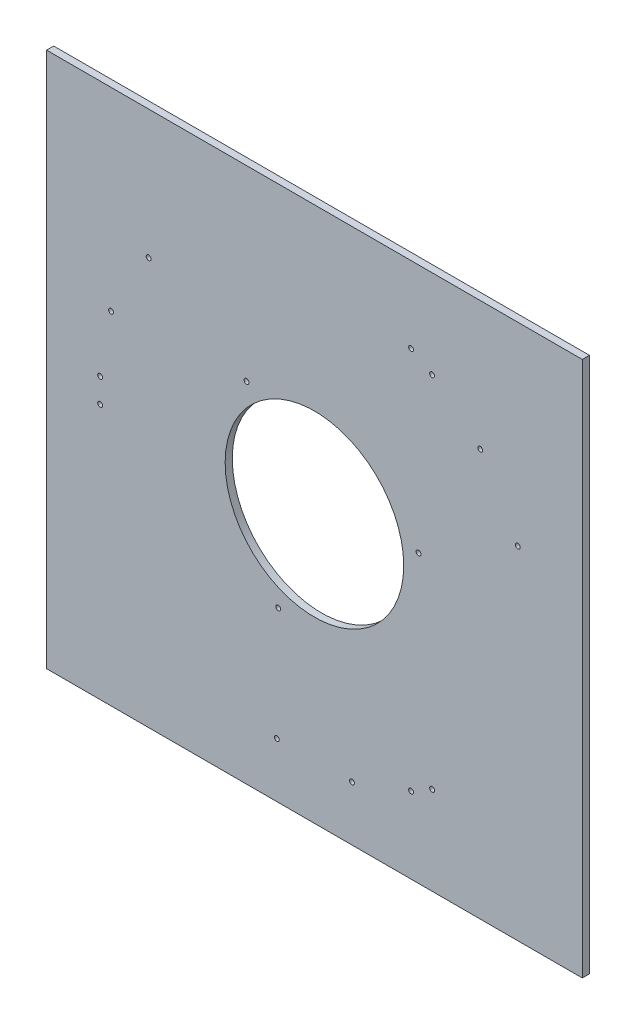
ISO-10303-21;
HEADER;
FILE_DESCRIPTION(('STEP AP214'),'2;1');
FILE_NAME('part.step','',(''),(''),'','','');
FILE_SCHEMA(('AUTOMOTIVE_DESIGN { 1 0 10303 214 1 1 1 1 }'));
ENDSEC;
DATA;
#1=APPLICATION_CONTEXT('core data for automotive mechanical design processes');
#2=APPLICATION_PROTOCOL_DEFINITION('international standard','automotive_design',2000,#1);
#3=PRODUCT_CONTEXT('',#1,'mechanical');
#4=PRODUCT('Part','Part','',(#3));
#5=PRODUCT_RELATED_PRODUCT_CATEGORY('part','',(#4));
#6=PRODUCT_DEFINITION_FORMATION('','',#4);
#7=PRODUCT_DEFINITION_CONTEXT('part definition',#1,'design');
#8=PRODUCT_DEFINITION('design','',#6,#7);
#9=PRODUCT_DEFINITION_SHAPE('','',#8);
#10=(LENGTH_UNIT() NAMED_UNIT(*) SI_UNIT(.MILLI.,.METRE.));
#11=(NAMED_UNIT(*) PLANE_ANGLE_UNIT() SI_UNIT($,.RADIAN.));
#12=(NAMED_UNIT(*) SI_UNIT($,.STERADIAN.) SOLID_ANGLE_UNIT());
#13=UNCERTAINTY_MEASURE_WITH_UNIT(LENGTH_MEASURE(1.E-05),#10,'distance_accuracy_value','');
#14=(GEOMETRIC_REPRESENTATION_CONTEXT(3) GLOBAL_UNCERTAINTY_ASSIGNED_CONTEXT((#13)) GLOBAL_UNIT_ASSIGNED_CONTEXT((#10,
#11,#12)) REPRESENTATION_CONTEXT('',''));
#15=CARTESIAN_POINT('',(0.,0.,0.));
#16=DIRECTION('',(0.,0.,1.));
#17=DIRECTION('',(1.,0.,0.));
#18=AXIS2_PLACEMENT_3D('',#15,#16,#17);
#19=CARTESIAN_POINT('',(0.,0.,5.));
#20=DIRECTION('',(0.,0.,-1.));
#21=DIRECTION('',(-1.,0.,0.));
#22=AXIS2_PLACEMENT_3D('',#19,#20,#21);
#23=PLANE('',#22);
#24=CARTESIAN_POINT('',(82.3612159321663,-125.653810567667,5.));
#25=DIRECTION('',(0.,0.,1.));
#26=DIRECTION('',(1.,0.,0.));
#27=AXIS2_PLACEMENT_3D('',#24,#25,#26);
#28=CIRCLE('',#27,1.69999999999999);
#29=CARTESIAN_POINT('',(84.0612159321663,-125.653810567667,5.));
#30=VERTEX_POINT('',#29);
#31=EDGE_CURVE('E207',#30,#30,#28,.T.);
#32=ORIENTED_EDGE('',*,*,#31,.F.);
#33=EDGE_LOOP('',(#32));
#34=FACE_BOUND('',#33,.T.);
#35=CARTESIAN_POINT('',(67.6387840678362,-134.153810567664,5.));
#36=DIRECTION('',(0.,0.,1.));
#37=DIRECTION('',(1.,0.,0.));
#38=AXIS2_PLACEMENT_3D('',#35,#36,#37);
#39=CIRCLE('',#38,1.69999999999999);
#40=CARTESIAN_POINT('',(69.3387840678362,-134.153810567664,5.));
#41=VERTEX_POINT('',#40);
#42=EDGE_CURVE('E201',#41,#41,#39,.T.);
#43=ORIENTED_EDGE('',*,*,#42,.F.);
#44=EDGE_LOOP('',(#43));
#45=FACE_BOUND('',#44,.T.);
#46=CARTESIAN_POINT('',(-150.,8.49999999999623,5.));
#47=DIRECTION('',(0.,0.,1.));
#48=DIRECTION('',(1.,0.,0.));
#49=AXIS2_PLACEMENT_3D('',#46,#47,#48);
#50=CIRCLE('',#49,1.69999999999998);
#51=CARTESIAN_POINT('',(-148.3,8.49999999999623,5.));
#52=VERTEX_POINT('',#51);
#53=EDGE_CURVE('E189',#52,#52,#50,.T.);
#54=ORIENTED_EDGE('',*,*,#53,.F.);
#55=EDGE_LOOP('',(#54));
#56=FACE_BOUND('',#55,.T.);
#57=CARTESIAN_POINT('',(67.638784067835,134.153810567664,5.));
#58=DIRECTION('',(0.,0.,1.));
#59=DIRECTION('',(1.,0.,0.));
#60=AXIS2_PLACEMENT_3D('',#57,#58,#59);
#61=CIRCLE('',#60,1.69999999999999);
#62=CARTESIAN_POINT('',(69.338784067835,134.153810567664,5.));
#63=VERTEX_POINT('',#62);
#64=EDGE_CURVE('E183',#63,#63,#61,.T.);
#65=ORIENTED_EDGE('',*,*,#64,.F.);
#66=EDGE_LOOP('',(#65));
#67=FACE_BOUND('',#66,.T.);
#68=CARTESIAN_POINT('',(82.3612159321651,125.653810567667,5.));
#69=DIRECTION('',(0.,0.,1.));
#70=DIRECTION('',(1.,0.,0.));
#71=AXIS2_PLACEMENT_3D('',#68,#69,#70);
#72=CIRCLE('',#71,1.69999999999999);
#73=CARTESIAN_POINT('',(84.0612159321651,125.653810567667,5.));
#74=VERTEX_POINT('',#73);
#75=EDGE_CURVE('E177',#74,#74,#72,.T.);
#76=ORIENTED_EDGE('',*,*,#75,.F.);
#77=EDGE_LOOP('',(#76));
#78=FACE_BOUND('',#77,.T.);
#79=CARTESIAN_POINT('',(72.8757737229035,12.8499651473521,5.));
#80=DIRECTION('',(0.,0.,1.));
#81=DIRECTION('',(1.,0.,0.));
#82=AXIS2_PLACEMENT_3D('',#79,#80,#81);
#83=CIRCLE('',#82,1.69999999999999);
#84=CARTESIAN_POINT('',(74.5757737229035,12.8499651473521,5.));
#85=VERTEX_POINT('',#84);
#86=EDGE_CURVE('E171',#85,#85,#83,.T.);
#87=ORIENTED_EDGE('',*,*,#86,.F.);
#88=EDGE_LOOP('',(#87));
#89=FACE_BOUND('',#88,.T.);
#90=CARTESIAN_POINT('',(-47.5662831168036,56.6872887908046,5.));
#91=DIRECTION('',(0.,0.,1.));
#92=DIRECTION('',(1.,0.,0.));
#93=AXIS2_PLACEMENT_3D('',#90,#91,#92);
#94=CIRCLE('',#93,1.69999999999999);
#95=CARTESIAN_POINT('',(-45.8662831168036,56.6872887908046,5.));
#96=VERTEX_POINT('',#95);
#97=EDGE_CURVE('E165',#96,#96,#94,.T.);
#98=ORIENTED_EDGE('',*,*,#97,.F.);
#99=EDGE_LOOP('',(#98));
#100=FACE_BOUND('',#99,.T.);
#101=CARTESIAN_POINT('',(-116.055733132526,97.3823228675097,5.));
#102=DIRECTION('',(0.,0.,1.));
#103=DIRECTION('',(1.,0.,0.));
#104=AXIS2_PLACEMENT_3D('',#101,#102,#103);
#105=CIRCLE('',#104,1.69999999999999);
#106=CARTESIAN_POINT('',(-114.355733132526,97.3823228675097,5.));
#107=VERTEX_POINT('',#106);
#108=EDGE_CURVE('E153',#107,#107,#105,.T.);
#109=ORIENTED_EDGE('',*,*,#108,.F.);
#110=EDGE_LOOP('',(#109));
#111=FACE_BOUND('',#110,.T.);
#112=CARTESIAN_POINT('',(116.055733132525,97.3823228675114,5.));
#113=DIRECTION('',(0.,0.,1.));
#114=DIRECTION('',(1.,0.,0.));
#115=AXIS2_PLACEMENT_3D('',#112,#113,#114);
#116=CIRCLE('',#115,1.69999999999999);
#117=CARTESIAN_POINT('',(117.755733132525,97.3823228675114,5.));
#118=VERTEX_POINT('',#117);
#119=EDGE_CURVE('E135',#118,#118,#116,.T.);
#120=ORIENTED_EDGE('',*,*,#119,.F.);
#121=EDGE_LOOP('',(#120));
#122=FACE_BOUND('',#121,.T.);
#123=CARTESIAN_POINT('',(26.3076989165401,-149.198374581349,5.));
#124=DIRECTION('',(0.,0.,1.));
#125=DIRECTION('',(1.,0.,0.));
#126=AXIS2_PLACEMENT_3D('',#123,#124,#125);
#127=CIRCLE('',#126,1.7);
#128=CARTESIAN_POINT('',(28.0076989165401,-149.198374581349,5.));
#129=VERTEX_POINT('',#128);
#130=EDGE_CURVE('E123',#129,#129,#127,.T.);
#131=ORIENTED_EDGE('',*,*,#130,.F.);
#132=EDGE_LOOP('',(#131));
#133=FACE_BOUND('',#132,.T.);
#134=CARTESIAN_POINT('',(0.,0.,5.));
#135=DIRECTION('',(0.,0.,1.));
#136=DIRECTION('',(1.,0.,0.));
#137=AXIS2_PLACEMENT_3D('',#134,#135,#136);
#138=CIRCLE('',#137,62.5);
#139=CARTESIAN_POINT('',(62.5,0.,5.));
#140=VERTEX_POINT('',#139);
#141=EDGE_CURVE('E104',#140,#140,#138,.T.);
#142=ORIENTED_EDGE('',*,*,#141,.F.);
#143=EDGE_LOOP('',(#142));
#144=FACE_BOUND('',#143,.T.);
#145=DIRECTION('',(0.,-1.,0.));
#146=VECTOR('',#145,1.);
#147=CARTESIAN_POINT('',(-187.5,187.5,5.));
#148=LINE('',#147,#146);
#149=CARTESIAN_POINT('',(-187.5,187.5,5.));
#150=VERTEX_POINT('',#149);
#151=CARTESIAN_POINT('',(-187.5,-187.5,5.));
#152=VERTEX_POINT('',#151);
#153=EDGE_CURVE('E89',#150,#152,#148,.T.);
#154=ORIENTED_EDGE('',*,*,#153,.T.);
#155=DIRECTION('',(1.,0.,0.));
#156=VECTOR('',#155,1.);
#157=CARTESIAN_POINT('',(187.5,-187.5,5.));
#158=LINE('',#157,#156);
#159=CARTESIAN_POINT('',(187.5,-187.5,5.));
#160=VERTEX_POINT('',#159);
#161=EDGE_CURVE('E84',#152,#160,#158,.T.);
#162=ORIENTED_EDGE('',*,*,#161,.T.);
#163=DIRECTION('',(0.,1.,0.));
#164=VECTOR('',#163,1.);
#165=CARTESIAN_POINT('',(187.5,187.5,5.));
#166=LINE('',#165,#164);
#167=CARTESIAN_POINT('',(187.5,187.5,5.));
#168=VERTEX_POINT('',#167);
#169=EDGE_CURVE('E87',#160,#168,#166,.T.);
#170=ORIENTED_EDGE('',*,*,#169,.T.);
#171=DIRECTION('',(-1.,0.,0.));
#172=VECTOR('',#171,1.);
#173=CARTESIAN_POINT('',(187.5,187.5,5.));
#174=LINE('',#173,#172);
#175=EDGE_CURVE('E54',#168,#150,#174,.T.);
#176=ORIENTED_EDGE('',*,*,#175,.T.);
#177=EDGE_LOOP('',(#154,#162,#170,#176));
#178=FACE_BOUND('',#177,.T.);
#179=CARTESIAN_POINT('',(-26.30769891654,-149.19837458135,5.));
#180=DIRECTION('',(0.,0.,1.));
#181=DIRECTION('',(1.,0.,0.));
#182=AXIS2_PLACEMENT_3D('',#179,#180,#181);
#183=CIRCLE('',#182,1.7);
#184=CARTESIAN_POINT('',(-24.60769891654,-149.19837458135,5.));
#185=VERTEX_POINT('',#184);
#186=EDGE_CURVE('E129',#185,#185,#183,.T.);
#187=ORIENTED_EDGE('',*,*,#186,.F.);
#188=EDGE_LOOP('',(#187));
#189=FACE_BOUND('',#188,.T.);
#190=CARTESIAN_POINT('',(142.363432049065,51.8160517138394,5.));
#191=DIRECTION('',(0.,0.,1.));
#192=DIRECTION('',(1.,0.,0.));
#193=AXIS2_PLACEMENT_3D('',#190,#191,#192);
#194=CIRCLE('',#193,1.70000000000001);
#195=CARTESIAN_POINT('',(144.063432049065,51.8160517138394,5.));
#196=VERTEX_POINT('',#195);
#197=EDGE_CURVE('E141',#196,#196,#194,.T.);
#198=ORIENTED_EDGE('',*,*,#197,.F.);
#199=EDGE_LOOP('',(#198));
#200=FACE_BOUND('',#199,.T.);
#201=CARTESIAN_POINT('',(-142.363432049066,51.8160517138373,5.));
#202=DIRECTION('',(0.,0.,1.));
#203=DIRECTION('',(1.,0.,0.));
#204=AXIS2_PLACEMENT_3D('',#201,#202,#203);
#205=CIRCLE('',#204,1.70000000000001);
#206=CARTESIAN_POINT('',(-140.663432049066,51.8160517138373,5.));
#207=VERTEX_POINT('',#206);
#208=EDGE_CURVE('E147',#207,#207,#205,.T.);
#209=ORIENTED_EDGE('',*,*,#208,.F.);
#210=EDGE_LOOP('',(#209));
#211=FACE_BOUND('',#210,.T.);
#212=CARTESIAN_POINT('',(-25.3094906060995,-69.5372539381572,5.));
#213=DIRECTION('',(0.,0.,1.));
#214=DIRECTION('',(1.,0.,0.));
#215=AXIS2_PLACEMENT_3D('',#212,#213,#214);
#216=CIRCLE('',#215,1.69999999999999);
#217=CARTESIAN_POINT('',(-23.6094906060995,-69.5372539381572,5.));
#218=VERTEX_POINT('',#217);
#219=EDGE_CURVE('E159',#218,#218,#216,.T.);
#220=ORIENTED_EDGE('',*,*,#219,.F.);
#221=EDGE_LOOP('',(#220));
#222=FACE_BOUND('',#221,.T.);
#223=CARTESIAN_POINT('',(-150.,-8.49999999999761,5.));
#224=DIRECTION('',(0.,0.,1.));
#225=DIRECTION('',(1.,0.,0.));
#226=AXIS2_PLACEMENT_3D('',#223,#224,#225);
#227=CIRCLE('',#226,1.69999999999998);
#228=CARTESIAN_POINT('',(-148.3,-8.49999999999761,5.));
#229=VERTEX_POINT('',#228);
#230=EDGE_CURVE('E195',#229,#229,#227,.T.);
#231=ORIENTED_EDGE('',*,*,#230,.F.);
#232=EDGE_LOOP('',(#231));
#233=FACE_BOUND('',#232,.T.);
#234=ADVANCED_FACE('F37',(#34,#45,#56,#67,#78,#89,#100,#111,#122,#133,#144,#178,#189,#200,#211,
#222,#233),#23,.F.);
#235=CARTESIAN_POINT('',(-187.5,187.5,5.));
#236=DIRECTION('',(1.,0.,0.));
#237=DIRECTION('',(0.,1.,0.));
#238=AXIS2_PLACEMENT_3D('',#235,#236,#237);
#239=PLANE('',#238);
#240=DIRECTION('',(0.,-1.,0.));
#241=VECTOR('',#240,1.);
#242=CARTESIAN_POINT('',(-187.5,187.5,0.));
#243=LINE('',#242,#241);
#244=CARTESIAN_POINT('',(-187.5,187.5,0.));
#245=VERTEX_POINT('',#244);
#246=CARTESIAN_POINT('',(-187.5,-187.5,0.));
#247=VERTEX_POINT('',#246);
#248=EDGE_CURVE('E101',#245,#247,#243,.T.);
#249=ORIENTED_EDGE('',*,*,#248,.T.);
#250=DIRECTION('',(0.,0.,-1.));
#251=VECTOR('',#250,1.);
#252=CARTESIAN_POINT('',(-187.5,-187.5,5.));
#253=LINE('',#252,#251);
#254=EDGE_CURVE('E11',#152,#247,#253,.T.);
#255=ORIENTED_EDGE('',*,*,#254,.F.);
#256=ORIENTED_EDGE('',*,*,#153,.F.);
#257=DIRECTION('',(0.,0.,-1.));
#258=VECTOR('',#257,1.);
#259=CARTESIAN_POINT('',(-187.5,187.5,5.));
#260=LINE('',#259,#258);
#261=EDGE_CURVE('E97',#150,#245,#260,.T.);
#262=ORIENTED_EDGE('',*,*,#261,.T.);
#263=EDGE_LOOP('',(#249,#255,#256,#262));
#264=FACE_BOUND('',#263,.T.);
#265=ADVANCED_FACE('F39',(#264),#239,.F.);
#266=CARTESIAN_POINT('',(187.5,-187.5,5.));
#267=DIRECTION('',(0.,1.,0.));
#268=DIRECTION('',(-1.,0.,0.));
#269=AXIS2_PLACEMENT_3D('',#266,#267,#268);
#270=PLANE('',#269);
#271=DIRECTION('',(1.,0.,0.));
#272=VECTOR('',#271,1.);
#273=CARTESIAN_POINT('',(187.5,-187.5,0.));
#274=LINE('',#273,#272);
#275=CARTESIAN_POINT('',(187.5,-187.5,0.));
#276=VERTEX_POINT('',#275);
#277=EDGE_CURVE('E93',#247,#276,#274,.T.);
#278=ORIENTED_EDGE('',*,*,#277,.T.);
#279=DIRECTION('',(0.,0.,-1.));
#280=VECTOR('',#279,1.);
#281=CARTESIAN_POINT('',(187.5,-187.5,5.));
#282=LINE('',#281,#280);
#283=EDGE_CURVE('E46',#160,#276,#282,.T.);
#284=ORIENTED_EDGE('',*,*,#283,.F.);
#285=ORIENTED_EDGE('',*,*,#161,.F.);
#286=ORIENTED_EDGE('',*,*,#254,.T.);
#287=EDGE_LOOP('',(#278,#284,#285,#286));
#288=FACE_BOUND('',#287,.T.);
#289=ADVANCED_FACE('F92',(#288),#270,.F.);
#290=CARTESIAN_POINT('',(187.5,187.5,5.));
#291=DIRECTION('',(-1.,0.,0.));
#292=DIRECTION('',(0.,-1.,0.));
#293=AXIS2_PLACEMENT_3D('',#290,#291,#292);
#294=PLANE('',#293);
#295=DIRECTION('',(0.,1.,0.));
#296=VECTOR('',#295,1.);
#297=CARTESIAN_POINT('',(187.5,187.5,0.));
#298=LINE('',#297,#296);
#299=CARTESIAN_POINT('',(187.5,187.5,0.));
#300=VERTEX_POINT('',#299);
#301=EDGE_CURVE('E71',#276,#300,#298,.T.);
#302=ORIENTED_EDGE('',*,*,#301,.T.);
#303=DIRECTION('',(0.,0.,-1.));
#304=VECTOR('',#303,1.);
#305=CARTESIAN_POINT('',(187.5,187.5,5.));
#306=LINE('',#305,#304);
#307=EDGE_CURVE('E94',#168,#300,#306,.T.);
#308=ORIENTED_EDGE('',*,*,#307,.F.);
#309=ORIENTED_EDGE('',*,*,#169,.F.);
#310=ORIENTED_EDGE('',*,*,#283,.T.);
#311=EDGE_LOOP('',(#302,#308,#309,#310));
#312=FACE_BOUND('',#311,.T.);
#313=ADVANCED_FACE('F95',(#312),#294,.F.);
#314=CARTESIAN_POINT('',(187.5,187.5,5.));
#315=DIRECTION('',(0.,-1.,0.));
#316=DIRECTION('',(1.,0.,0.));
#317=AXIS2_PLACEMENT_3D('',#314,#315,#316);
#318=PLANE('',#317);
#319=DIRECTION('',(-1.,0.,0.));
#320=VECTOR('',#319,1.);
#321=CARTESIAN_POINT('',(187.5,187.5,0.));
#322=LINE('',#321,#320);
#323=EDGE_CURVE('E77',#300,#245,#322,.T.);
#324=ORIENTED_EDGE('',*,*,#323,.T.);
#325=ORIENTED_EDGE('',*,*,#261,.F.);
#326=ORIENTED_EDGE('',*,*,#175,.F.);
#327=ORIENTED_EDGE('',*,*,#307,.T.);
#328=EDGE_LOOP('',(#324,#325,#326,#327));
#329=FACE_BOUND('',#328,.T.);
#330=ADVANCED_FACE('F109',(#329),#318,.F.);
#331=CARTESIAN_POINT('',(0.,0.,0.));
#332=DIRECTION('',(0.,0.,-1.));
#333=DIRECTION('',(-1.,0.,0.));
#334=AXIS2_PLACEMENT_3D('',#331,#332,#333);
#335=PLANE('',#334);
#336=CARTESIAN_POINT('',(82.3612159321663,-125.653810567667,0.));
#337=DIRECTION('',(0.,0.,-1.));
#338=DIRECTION('',(-1.,0.,0.));
#339=AXIS2_PLACEMENT_3D('',#336,#337,#338);
#340=CIRCLE('',#339,1.69999999999999);
#341=CARTESIAN_POINT('',(80.6612159321663,-125.653810567667,0.));
#342=VERTEX_POINT('',#341);
#343=EDGE_CURVE('E204',#342,#342,#340,.T.);
#344=ORIENTED_EDGE('',*,*,#343,.F.);
#345=EDGE_LOOP('',(#344));
#346=FACE_BOUND('',#345,.T.);
#347=CARTESIAN_POINT('',(67.6387840678362,-134.153810567664,0.));
#348=DIRECTION('',(0.,0.,-1.));
#349=DIRECTION('',(-1.,0.,0.));
#350=AXIS2_PLACEMENT_3D('',#347,#348,#349);
#351=CIRCLE('',#350,1.69999999999999);
#352=CARTESIAN_POINT('',(65.9387840678363,-134.153810567664,0.));
#353=VERTEX_POINT('',#352);
#354=EDGE_CURVE('E198',#353,#353,#351,.T.);
#355=ORIENTED_EDGE('',*,*,#354,.F.);
#356=EDGE_LOOP('',(#355));
#357=FACE_BOUND('',#356,.T.);
#358=CARTESIAN_POINT('',(-150.,-8.49999999999761,0.));
#359=DIRECTION('',(0.,0.,-1.));
#360=DIRECTION('',(-1.,0.,0.));
#361=AXIS2_PLACEMENT_3D('',#358,#359,#360);
#362=CIRCLE('',#361,1.69999999999999);
#363=CARTESIAN_POINT('',(-151.7,-8.49999999999761,0.));
#364=VERTEX_POINT('',#363);
#365=EDGE_CURVE('E192',#364,#364,#362,.T.);
#366=ORIENTED_EDGE('',*,*,#365,.F.);
#367=EDGE_LOOP('',(#366));
#368=FACE_BOUND('',#367,.T.);
#369=CARTESIAN_POINT('',(-150.,8.49999999999623,0.));
#370=DIRECTION('',(0.,0.,-1.));
#371=DIRECTION('',(-1.,0.,0.));
#372=AXIS2_PLACEMENT_3D('',#369,#370,#371);
#373=CIRCLE('',#372,1.69999999999999);
#374=CARTESIAN_POINT('',(-151.7,8.49999999999623,0.));
#375=VERTEX_POINT('',#374);
#376=EDGE_CURVE('E186',#375,#375,#373,.T.);
#377=ORIENTED_EDGE('',*,*,#376,.F.);
#378=EDGE_LOOP('',(#377));
#379=FACE_BOUND('',#378,.T.);
#380=CARTESIAN_POINT('',(67.638784067835,134.153810567664,0.));
#381=DIRECTION('',(0.,0.,-1.));
#382=DIRECTION('',(-1.,0.,0.));
#383=AXIS2_PLACEMENT_3D('',#380,#381,#382);
#384=CIRCLE('',#383,1.69999999999999);
#385=CARTESIAN_POINT('',(65.938784067835,134.153810567664,0.));
#386=VERTEX_POINT('',#385);
#387=EDGE_CURVE('E180',#386,#386,#384,.T.);
#388=ORIENTED_EDGE('',*,*,#387,.F.);
#389=EDGE_LOOP('',(#388));
#390=FACE_BOUND('',#389,.T.);
#391=CARTESIAN_POINT('',(82.3612159321651,125.653810567667,0.));
#392=DIRECTION('',(0.,0.,-1.));
#393=DIRECTION('',(-1.,0.,0.));
#394=AXIS2_PLACEMENT_3D('',#391,#392,#393);
#395=CIRCLE('',#394,1.69999999999999);
#396=CARTESIAN_POINT('',(80.6612159321651,125.653810567667,0.));
#397=VERTEX_POINT('',#396);
#398=EDGE_CURVE('E174',#397,#397,#395,.T.);
#399=ORIENTED_EDGE('',*,*,#398,.F.);
#400=EDGE_LOOP('',(#399));
#401=FACE_BOUND('',#400,.T.);
#402=CARTESIAN_POINT('',(72.8757737229035,12.8499651473521,0.));
#403=DIRECTION('',(0.,0.,-1.));
#404=DIRECTION('',(-1.,0.,0.));
#405=AXIS2_PLACEMENT_3D('',#402,#403,#404);
#406=CIRCLE('',#405,1.69999999999999);
#407=CARTESIAN_POINT('',(71.1757737229035,12.8499651473521,0.));
#408=VERTEX_POINT('',#407);
#409=EDGE_CURVE('E168',#408,#408,#406,.T.);
#410=ORIENTED_EDGE('',*,*,#409,.F.);
#411=EDGE_LOOP('',(#410));
#412=FACE_BOUND('',#411,.T.);
#413=CARTESIAN_POINT('',(-47.5662831168036,56.6872887908046,0.));
#414=DIRECTION('',(0.,0.,-1.));
#415=DIRECTION('',(-1.,0.,0.));
#416=AXIS2_PLACEMENT_3D('',#413,#414,#415);
#417=CIRCLE('',#416,1.69999999999999);
#418=CARTESIAN_POINT('',(-49.2662831168036,56.6872887908046,0.));
#419=VERTEX_POINT('',#418);
#420=EDGE_CURVE('E162',#419,#419,#417,.T.);
#421=ORIENTED_EDGE('',*,*,#420,.F.);
#422=EDGE_LOOP('',(#421));
#423=FACE_BOUND('',#422,.T.);
#424=CARTESIAN_POINT('',(-25.3094906060995,-69.5372539381572,0.));
#425=DIRECTION('',(0.,0.,-1.));
#426=DIRECTION('',(-1.,0.,0.));
#427=AXIS2_PLACEMENT_3D('',#424,#425,#426);
#428=CIRCLE('',#427,1.69999999999999);
#429=CARTESIAN_POINT('',(-27.0094906060995,-69.5372539381572,0.));
#430=VERTEX_POINT('',#429);
#431=EDGE_CURVE('E156',#430,#430,#428,.T.);
#432=ORIENTED_EDGE('',*,*,#431,.F.);
#433=EDGE_LOOP('',(#432));
#434=FACE_BOUND('',#433,.T.);
#435=CARTESIAN_POINT('',(-116.055733132526,97.3823228675097,0.));
#436=DIRECTION('',(0.,0.,-1.));
#437=DIRECTION('',(-1.,0.,0.));
#438=AXIS2_PLACEMENT_3D('',#435,#436,#437);
#439=CIRCLE('',#438,1.69999999999999);
#440=CARTESIAN_POINT('',(-117.755733132526,97.3823228675097,0.));
#441=VERTEX_POINT('',#440);
#442=EDGE_CURVE('E150',#441,#441,#439,.T.);
#443=ORIENTED_EDGE('',*,*,#442,.F.);
#444=EDGE_LOOP('',(#443));
#445=FACE_BOUND('',#444,.T.);
#446=CARTESIAN_POINT('',(-142.363432049066,51.8160517138373,0.));
#447=DIRECTION('',(0.,0.,-1.));
#448=DIRECTION('',(-1.,0.,0.));
#449=AXIS2_PLACEMENT_3D('',#446,#447,#448);
#450=CIRCLE('',#449,1.70000000000001);
#451=CARTESIAN_POINT('',(-144.063432049066,51.8160517138373,0.));
#452=VERTEX_POINT('',#451);
#453=EDGE_CURVE('E144',#452,#452,#450,.T.);
#454=ORIENTED_EDGE('',*,*,#453,.F.);
#455=EDGE_LOOP('',(#454));
#456=FACE_BOUND('',#455,.T.);
#457=CARTESIAN_POINT('',(142.363432049065,51.8160517138394,0.));
#458=DIRECTION('',(0.,0.,-1.));
#459=DIRECTION('',(-1.,0.,0.));
#460=AXIS2_PLACEMENT_3D('',#457,#458,#459);
#461=CIRCLE('',#460,1.70000000000001);
#462=CARTESIAN_POINT('',(140.663432049065,51.8160517138394,0.));
#463=VERTEX_POINT('',#462);
#464=EDGE_CURVE('E138',#463,#463,#461,.T.);
#465=ORIENTED_EDGE('',*,*,#464,.F.);
#466=EDGE_LOOP('',(#465));
#467=FACE_BOUND('',#466,.T.);
#468=CARTESIAN_POINT('',(116.055733132525,97.3823228675114,0.));
#469=DIRECTION('',(0.,0.,-1.));
#470=DIRECTION('',(-1.,0.,0.));
#471=AXIS2_PLACEMENT_3D('',#468,#469,#470);
#472=CIRCLE('',#471,1.69999999999999);
#473=CARTESIAN_POINT('',(114.355733132525,97.3823228675114,0.));
#474=VERTEX_POINT('',#473);
#475=EDGE_CURVE('E132',#474,#474,#472,.T.);
#476=ORIENTED_EDGE('',*,*,#475,.F.);
#477=EDGE_LOOP('',(#476));
#478=FACE_BOUND('',#477,.T.);
#479=CARTESIAN_POINT('',(-26.30769891654,-149.19837458135,0.));
#480=DIRECTION('',(0.,0.,-1.));
#481=DIRECTION('',(-1.,0.,0.));
#482=AXIS2_PLACEMENT_3D('',#479,#480,#481);
#483=CIRCLE('',#482,1.7);
#484=CARTESIAN_POINT('',(-28.00769891654,-149.19837458135,0.));
#485=VERTEX_POINT('',#484);
#486=EDGE_CURVE('E126',#485,#485,#483,.T.);
#487=ORIENTED_EDGE('',*,*,#486,.F.);
#488=EDGE_LOOP('',(#487));
#489=FACE_BOUND('',#488,.T.);
#490=CARTESIAN_POINT('',(26.3076989165401,-149.198374581349,0.));
#491=DIRECTION('',(0.,0.,-1.));
#492=DIRECTION('',(-1.,0.,0.));
#493=AXIS2_PLACEMENT_3D('',#490,#491,#492);
#494=CIRCLE('',#493,1.7);
#495=CARTESIAN_POINT('',(24.6076989165401,-149.198374581349,0.));
#496=VERTEX_POINT('',#495);
#497=EDGE_CURVE('E118',#496,#496,#494,.T.);
#498=ORIENTED_EDGE('',*,*,#497,.F.);
#499=EDGE_LOOP('',(#498));
#500=FACE_BOUND('',#499,.T.);
#501=CARTESIAN_POINT('',(0.,0.,0.));
#502=DIRECTION('',(0.,0.,-1.));
#503=DIRECTION('',(-1.,0.,0.));
#504=AXIS2_PLACEMENT_3D('',#501,#502,#503);
#505=CIRCLE('',#504,62.5);
#506=CARTESIAN_POINT('',(-62.5,0.,0.));
#507=VERTEX_POINT('',#506);
#508=EDGE_CURVE('E115',#507,#507,#505,.F.);
#509=ORIENTED_EDGE('',*,*,#508,.T.);
#510=EDGE_LOOP('',(#509));
#511=FACE_BOUND('',#510,.T.);
#512=ORIENTED_EDGE('',*,*,#248,.F.);
#513=ORIENTED_EDGE('',*,*,#323,.F.);
#514=ORIENTED_EDGE('',*,*,#301,.F.);
#515=ORIENTED_EDGE('',*,*,#277,.F.);
#516=EDGE_LOOP('',(#512,#513,#514,#515));
#517=FACE_BOUND('',#516,.T.);
#518=ADVANCED_FACE('F112',(#346,#357,#368,#379,#390,#401,#412,#423,#434,#445,#456,#467,#478,
#489,#500,#511,#517),#335,.T.);
#519=CARTESIAN_POINT('',(0.,0.,-0.00100000000000013));
#520=DIRECTION('',(0.,0.,1.));
#521=DIRECTION('',(1.,0.,0.));
#522=AXIS2_PLACEMENT_3D('',#519,#520,#521);
#523=CYLINDRICAL_SURFACE('',#522,62.5);
#524=ORIENTED_EDGE('',*,*,#508,.F.);
#525=EDGE_LOOP('',(#524));
#526=FACE_BOUND('',#525,.T.);
#527=ORIENTED_EDGE('',*,*,#141,.T.);
#528=EDGE_LOOP('',(#527));
#529=FACE_BOUND('',#528,.T.);
#530=ADVANCED_FACE('F237',(#526,#529),#523,.F.);
#531=CARTESIAN_POINT('',(26.3076989165401,-149.198374581349,5.));
#532=DIRECTION('',(0.,0.,1.));
#533=DIRECTION('',(1.,0.,0.));
#534=AXIS2_PLACEMENT_3D('',#531,#532,#533);
#535=CYLINDRICAL_SURFACE('',#534,1.7);
#536=ORIENTED_EDGE('',*,*,#130,.T.);
#537=EDGE_LOOP('',(#536));
#538=FACE_BOUND('',#537,.T.);
#539=ORIENTED_EDGE('',*,*,#497,.T.);
#540=EDGE_LOOP('',(#539));
#541=FACE_BOUND('',#540,.T.);
#542=ADVANCED_FACE('F239',(#538,#541),#535,.F.);
#543=CARTESIAN_POINT('',(-26.30769891654,-149.19837458135,5.));
#544=DIRECTION('',(0.,0.,1.));
#545=DIRECTION('',(1.,0.,0.));
#546=AXIS2_PLACEMENT_3D('',#543,#544,#545);
#547=CYLINDRICAL_SURFACE('',#546,1.7);
#548=ORIENTED_EDGE('',*,*,#186,.T.);
#549=EDGE_LOOP('',(#548));
#550=FACE_BOUND('',#549,.T.);
#551=ORIENTED_EDGE('',*,*,#486,.T.);
#552=EDGE_LOOP('',(#551));
#553=FACE_BOUND('',#552,.T.);
#554=ADVANCED_FACE('F246',(#550,#553),#547,.F.);
#555=CARTESIAN_POINT('',(116.055733132525,97.3823228675114,5.));
#556=DIRECTION('',(0.,0.,1.));
#557=DIRECTION('',(1.,0.,0.));
#558=AXIS2_PLACEMENT_3D('',#555,#556,#557);
#559=CYLINDRICAL_SURFACE('',#558,1.69999999999999);
#560=ORIENTED_EDGE('',*,*,#119,.T.);
#561=EDGE_LOOP('',(#560));
#562=FACE_BOUND('',#561,.T.);
#563=ORIENTED_EDGE('',*,*,#475,.T.);
#564=EDGE_LOOP('',(#563));
#565=FACE_BOUND('',#564,.T.);
#566=ADVANCED_FACE('F363',(#562,#565),#559,.F.);
#567=CARTESIAN_POINT('',(142.363432049065,51.8160517138394,5.));
#568=DIRECTION('',(0.,0.,1.));
#569=DIRECTION('',(1.,0.,0.));
#570=AXIS2_PLACEMENT_3D('',#567,#568,#569);
#571=CYLINDRICAL_SURFACE('',#570,1.70000000000001);
#572=ORIENTED_EDGE('',*,*,#197,.T.);
#573=EDGE_LOOP('',(#572));
#574=FACE_BOUND('',#573,.T.);
#575=ORIENTED_EDGE('',*,*,#464,.T.);
#576=EDGE_LOOP('',(#575));
#577=FACE_BOUND('',#576,.T.);
#578=ADVANCED_FACE('F359',(#574,#577),#571,.F.);
#579=CARTESIAN_POINT('',(-142.363432049066,51.8160517138373,5.));
#580=DIRECTION('',(0.,0.,1.));
#581=DIRECTION('',(1.,0.,0.));
#582=AXIS2_PLACEMENT_3D('',#579,#580,#581);
#583=CYLINDRICAL_SURFACE('',#582,1.70000000000001);
#584=ORIENTED_EDGE('',*,*,#208,.T.);
#585=EDGE_LOOP('',(#584));
#586=FACE_BOUND('',#585,.T.);
#587=ORIENTED_EDGE('',*,*,#453,.T.);
#588=EDGE_LOOP('',(#587));
#589=FACE_BOUND('',#588,.T.);
#590=ADVANCED_FACE('F355',(#586,#589),#583,.F.);
#591=CARTESIAN_POINT('',(-116.055733132526,97.3823228675097,5.));
#592=DIRECTION('',(0.,0.,1.));
#593=DIRECTION('',(1.,0.,0.));
#594=AXIS2_PLACEMENT_3D('',#591,#592,#593);
#595=CYLINDRICAL_SURFACE('',#594,1.69999999999999);
#596=ORIENTED_EDGE('',*,*,#108,.T.);
#597=EDGE_LOOP('',(#596));
#598=FACE_BOUND('',#597,.T.);
#599=ORIENTED_EDGE('',*,*,#442,.T.);
#600=EDGE_LOOP('',(#599));
#601=FACE_BOUND('',#600,.T.);
#602=ADVANCED_FACE('F351',(#598,#601),#595,.F.);
#603=CARTESIAN_POINT('',(-25.3094906060995,-69.5372539381572,5.));
#604=DIRECTION('',(0.,0.,1.));
#605=DIRECTION('',(1.,0.,0.));
#606=AXIS2_PLACEMENT_3D('',#603,#604,#605);
#607=CYLINDRICAL_SURFACE('',#606,1.69999999999999);
#608=ORIENTED_EDGE('',*,*,#219,.T.);
#609=EDGE_LOOP('',(#608));
#610=FACE_BOUND('',#609,.T.);
#611=ORIENTED_EDGE('',*,*,#431,.T.);
#612=EDGE_LOOP('',(#611));
#613=FACE_BOUND('',#612,.T.);
#614=ADVANCED_FACE('F347',(#610,#613),#607,.F.);
#615=CARTESIAN_POINT('',(-47.5662831168036,56.6872887908046,5.));
#616=DIRECTION('',(0.,0.,1.));
#617=DIRECTION('',(1.,0.,0.));
#618=AXIS2_PLACEMENT_3D('',#615,#616,#617);
#619=CYLINDRICAL_SURFACE('',#618,1.69999999999999);
#620=ORIENTED_EDGE('',*,*,#97,.T.);
#621=EDGE_LOOP('',(#620));
#622=FACE_BOUND('',#621,.T.);
#623=ORIENTED_EDGE('',*,*,#420,.T.);
#624=EDGE_LOOP('',(#623));
#625=FACE_BOUND('',#624,.T.);
#626=ADVANCED_FACE('F343',(#622,#625),#619,.F.);
#627=CARTESIAN_POINT('',(72.8757737229035,12.8499651473521,5.));
#628=DIRECTION('',(0.,0.,1.));
#629=DIRECTION('',(1.,0.,0.));
#630=AXIS2_PLACEMENT_3D('',#627,#628,#629);
#631=CYLINDRICAL_SURFACE('',#630,1.69999999999999);
#632=ORIENTED_EDGE('',*,*,#86,.T.);
#633=EDGE_LOOP('',(#632));
#634=FACE_BOUND('',#633,.T.);
#635=ORIENTED_EDGE('',*,*,#409,.T.);
#636=EDGE_LOOP('',(#635));
#637=FACE_BOUND('',#636,.T.);
#638=ADVANCED_FACE('F339',(#634,#637),#631,.F.);
#639=CARTESIAN_POINT('',(82.3612159321651,125.653810567667,5.));
#640=DIRECTION('',(0.,0.,1.));
#641=DIRECTION('',(1.,0.,0.));
#642=AXIS2_PLACEMENT_3D('',#639,#640,#641);
#643=CYLINDRICAL_SURFACE('',#642,1.69999999999999);
#644=ORIENTED_EDGE('',*,*,#75,.T.);
#645=EDGE_LOOP('',(#644));
#646=FACE_BOUND('',#645,.T.);
#647=ORIENTED_EDGE('',*,*,#398,.T.);
#648=EDGE_LOOP('',(#647));
#649=FACE_BOUND('',#648,.T.);
#650=ADVANCED_FACE('F335',(#646,#649),#643,.F.);
#651=CARTESIAN_POINT('',(67.638784067835,134.153810567664,5.));
#652=DIRECTION('',(0.,0.,1.));
#653=DIRECTION('',(1.,0.,0.));
#654=AXIS2_PLACEMENT_3D('',#651,#652,#653);
#655=CYLINDRICAL_SURFACE('',#654,1.69999999999999);
#656=ORIENTED_EDGE('',*,*,#64,.T.);
#657=EDGE_LOOP('',(#656));
#658=FACE_BOUND('',#657,.T.);
#659=ORIENTED_EDGE('',*,*,#387,.T.);
#660=EDGE_LOOP('',(#659));
#661=FACE_BOUND('',#660,.T.);
#662=ADVANCED_FACE('F275',(#658,#661),#655,.F.);
#663=CARTESIAN_POINT('',(-150.,8.49999999999623,5.));
#664=DIRECTION('',(0.,0.,1.));
#665=DIRECTION('',(1.,0.,0.));
#666=AXIS2_PLACEMENT_3D('',#663,#664,#665);
#667=CYLINDRICAL_SURFACE('',#666,1.69999999999999);
#668=ORIENTED_EDGE('',*,*,#53,.T.);
#669=EDGE_LOOP('',(#668));
#670=FACE_BOUND('',#669,.T.);
#671=ORIENTED_EDGE('',*,*,#376,.T.);
#672=EDGE_LOOP('',(#671));
#673=FACE_BOUND('',#672,.T.);
#674=ADVANCED_FACE('F289',(#670,#673),#667,.F.);
#675=CARTESIAN_POINT('',(-150.,-8.49999999999761,5.));
#676=DIRECTION('',(0.,0.,1.));
#677=DIRECTION('',(1.,0.,0.));
#678=AXIS2_PLACEMENT_3D('',#675,#676,#677);
#679=CYLINDRICAL_SURFACE('',#678,1.69999999999999);
#680=ORIENTED_EDGE('',*,*,#230,.T.);
#681=EDGE_LOOP('',(#680));
#682=FACE_BOUND('',#681,.T.);
#683=ORIENTED_EDGE('',*,*,#365,.T.);
#684=EDGE_LOOP('',(#683));
#685=FACE_BOUND('',#684,.T.);
#686=ADVANCED_FACE('F294',(#682,#685),#679,.F.);
#687=CARTESIAN_POINT('',(67.6387840678362,-134.153810567664,5.));
#688=DIRECTION('',(0.,0.,1.));
#689=DIRECTION('',(1.,0.,0.));
#690=AXIS2_PLACEMENT_3D('',#687,#688,#689);
#691=CYLINDRICAL_SURFACE('',#690,1.69999999999999);
#692=ORIENTED_EDGE('',*,*,#42,.T.);
#693=EDGE_LOOP('',(#692));
#694=FACE_BOUND('',#693,.T.);
#695=ORIENTED_EDGE('',*,*,#354,.T.);
#696=EDGE_LOOP('',(#695));
#697=FACE_BOUND('',#696,.T.);
#698=ADVANCED_FACE('F304',(#694,#697),#691,.F.);
#699=CARTESIAN_POINT('',(82.3612159321663,-125.653810567667,5.));
#700=DIRECTION('',(0.,0.,1.));
#701=DIRECTION('',(1.,0.,0.));
#702=AXIS2_PLACEMENT_3D('',#699,#700,#701);
#703=CYLINDRICAL_SURFACE('',#702,1.69999999999999);
#704=ORIENTED_EDGE('',*,*,#31,.T.);
#705=EDGE_LOOP('',(#704));
#706=FACE_BOUND('',#705,.T.);
#707=ORIENTED_EDGE('',*,*,#343,.T.);
#708=EDGE_LOOP('',(#707));
#709=FACE_BOUND('',#708,.T.);
#710=ADVANCED_FACE('F211',(#706,#709),#703,.F.);
#711=CLOSED_SHELL('',(#234,#265,#289,#313,#330,#518,#530,#542,#554,#566,#578,#590,#602,#614,
#626,#638,#650,#662,#674,#686,#698,#710));
#712=MANIFOLD_SOLID_BREP('B2',#711);
#713=ADVANCED_BREP_SHAPE_REPRESENTATION('',(#18,#712),#14);
#714=SHAPE_DEFINITION_REPRESENTATION(#9,#713);
ENDSEC;
END-ISO-10303-21;
